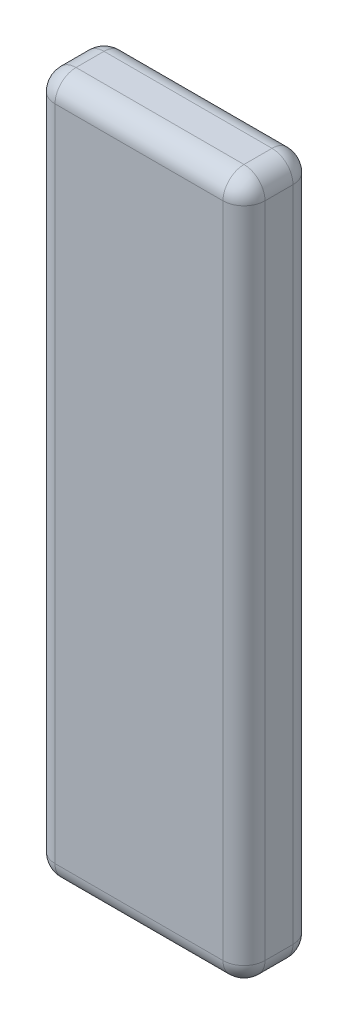
ISO-10303-21;
HEADER;
FILE_DESCRIPTION(('STEP AP214'),'2;1');
FILE_NAME('part.step','',(''),(''),'','','');
FILE_SCHEMA(('AUTOMOTIVE_DESIGN { 1 0 10303 214 1 1 1 1 }'));
ENDSEC;
DATA;
#1=APPLICATION_CONTEXT('core data for automotive mechanical design processes');
#2=APPLICATION_PROTOCOL_DEFINITION('international standard','automotive_design',2000,#1);
#3=PRODUCT_CONTEXT('',#1,'mechanical');
#4=PRODUCT('Part','Part','',(#3));
#5=PRODUCT_RELATED_PRODUCT_CATEGORY('part','',(#4));
#6=PRODUCT_DEFINITION_FORMATION('','',#4);
#7=PRODUCT_DEFINITION_CONTEXT('part definition',#1,'design');
#8=PRODUCT_DEFINITION('design','',#6,#7);
#9=PRODUCT_DEFINITION_SHAPE('','',#8);
#10=(LENGTH_UNIT() NAMED_UNIT(*) SI_UNIT(.MILLI.,.METRE.));
#11=(NAMED_UNIT(*) PLANE_ANGLE_UNIT() SI_UNIT($,.RADIAN.));
#12=(NAMED_UNIT(*) SI_UNIT($,.STERADIAN.) SOLID_ANGLE_UNIT());
#13=UNCERTAINTY_MEASURE_WITH_UNIT(LENGTH_MEASURE(1.E-05),#10,'distance_accuracy_value','');
#14=(GEOMETRIC_REPRESENTATION_CONTEXT(3) GLOBAL_UNCERTAINTY_ASSIGNED_CONTEXT((#13)) GLOBAL_UNIT_ASSIGNED_CONTEXT((#10,
#11,#12)) REPRESENTATION_CONTEXT('',''));
#15=CARTESIAN_POINT('',(0.,0.,0.));
#16=DIRECTION('',(0.,0.,1.));
#17=DIRECTION('',(1.,0.,0.));
#18=AXIS2_PLACEMENT_3D('',#15,#16,#17);
#19=CARTESIAN_POINT('',(0.,0.,2.));
#20=DIRECTION('',(1.,0.,0.));
#21=DIRECTION('',(0.,0.,-1.));
#22=AXIS2_PLACEMENT_3D('',#19,#20,#21);
#23=PLANE('',#22);
#24=DIRECTION('',(0.,-1.,0.));
#25=VECTOR('',#24,1.);
#26=CARTESIAN_POINT('',(0.,0.,1.4));
#27=LINE('',#26,#25);
#28=CARTESIAN_POINT('',(0.,-19.4,1.4));
#29=VERTEX_POINT('',#28);
#30=CARTESIAN_POINT('',(0.,-0.6,1.4));
#31=VERTEX_POINT('',#30);
#32=EDGE_CURVE('E135',#29,#31,#27,.F.);
#33=ORIENTED_EDGE('',*,*,#32,.T.);
#34=DIRECTION('',(0.,0.,-1.));
#35=VECTOR('',#34,1.);
#36=CARTESIAN_POINT('',(0.,-0.6,2.));
#37=LINE('',#36,#35);
#38=CARTESIAN_POINT('',(0.,-0.6,0.6));
#39=VERTEX_POINT('',#38);
#40=EDGE_CURVE('E172',#31,#39,#37,.T.);
#41=ORIENTED_EDGE('',*,*,#40,.T.);
#42=DIRECTION('',(0.,-1.,0.));
#43=VECTOR('',#42,1.);
#44=CARTESIAN_POINT('',(0.,0.,0.6));
#45=LINE('',#44,#43);
#46=CARTESIAN_POINT('',(0.,-19.4,0.6));
#47=VERTEX_POINT('',#46);
#48=EDGE_CURVE('E138',#39,#47,#45,.T.);
#49=ORIENTED_EDGE('',*,*,#48,.T.);
#50=DIRECTION('',(0.,0.,-1.));
#51=VECTOR('',#50,1.);
#52=CARTESIAN_POINT('',(0.,-19.4,2.));
#53=LINE('',#52,#51);
#54=EDGE_CURVE('E131',#47,#29,#53,.F.);
#55=ORIENTED_EDGE('',*,*,#54,.T.);
#56=EDGE_LOOP('',(#33,#41,#49,#55));
#57=FACE_BOUND('',#56,.T.);
#58=ADVANCED_FACE('F43',(#57),#23,.F.);
#59=CARTESIAN_POINT('',(0.,-20.,2.));
#60=DIRECTION('',(0.,1.,0.));
#61=DIRECTION('',(0.,0.,1.));
#62=AXIS2_PLACEMENT_3D('',#59,#60,#61);
#63=PLANE('',#62);
#64=DIRECTION('',(1.,0.,0.));
#65=VECTOR('',#64,1.);
#66=CARTESIAN_POINT('',(0.,-20.,1.4));
#67=LINE('',#66,#65);
#68=CARTESIAN_POINT('',(5.4,-20.,1.4));
#69=VERTEX_POINT('',#68);
#70=CARTESIAN_POINT('',(0.6,-20.,1.4));
#71=VERTEX_POINT('',#70);
#72=EDGE_CURVE('E192',#69,#71,#67,.F.);
#73=ORIENTED_EDGE('',*,*,#72,.T.);
#74=DIRECTION('',(0.,0.,-1.));
#75=VECTOR('',#74,1.);
#76=CARTESIAN_POINT('',(0.6,-20.,2.));
#77=LINE('',#76,#75);
#78=CARTESIAN_POINT('',(0.6,-20.,0.6));
#79=VERTEX_POINT('',#78);
#80=EDGE_CURVE('E149',#71,#79,#77,.T.);
#81=ORIENTED_EDGE('',*,*,#80,.T.);
#82=DIRECTION('',(1.,0.,0.));
#83=VECTOR('',#82,1.);
#84=CARTESIAN_POINT('',(0.,-20.,0.6));
#85=LINE('',#84,#83);
#86=CARTESIAN_POINT('',(5.4,-20.,0.6));
#87=VERTEX_POINT('',#86);
#88=EDGE_CURVE('E196',#79,#87,#85,.T.);
#89=ORIENTED_EDGE('',*,*,#88,.T.);
#90=DIRECTION('',(0.,0.,-1.));
#91=VECTOR('',#90,1.);
#92=CARTESIAN_POINT('',(5.4,-20.,2.));
#93=LINE('',#92,#91);
#94=EDGE_CURVE('E194',#87,#69,#93,.F.);
#95=ORIENTED_EDGE('',*,*,#94,.T.);
#96=EDGE_LOOP('',(#73,#81,#89,#95));
#97=FACE_BOUND('',#96,.T.);
#98=ADVANCED_FACE('F306',(#97),#63,.F.);
#99=CARTESIAN_POINT('',(6.,0.,2.));
#100=DIRECTION('',(-1.,0.,0.));
#101=DIRECTION('',(0.,-1.,0.));
#102=AXIS2_PLACEMENT_3D('',#99,#100,#101);
#103=PLANE('',#102);
#104=DIRECTION('',(0.,0.,-1.));
#105=VECTOR('',#104,1.);
#106=CARTESIAN_POINT('',(6.,-19.4,2.));
#107=LINE('',#106,#105);
#108=CARTESIAN_POINT('',(6.,-19.4,1.4));
#109=VERTEX_POINT('',#108);
#110=CARTESIAN_POINT('',(6.,-19.4,0.6));
#111=VERTEX_POINT('',#110);
#112=EDGE_CURVE('E203',#109,#111,#107,.T.);
#113=ORIENTED_EDGE('',*,*,#112,.T.);
#114=DIRECTION('',(0.,1.,0.));
#115=VECTOR('',#114,1.);
#116=CARTESIAN_POINT('',(6.,0.,0.6));
#117=LINE('',#116,#115);
#118=CARTESIAN_POINT('',(6.,-0.6,0.6));
#119=VERTEX_POINT('',#118);
#120=EDGE_CURVE('E206',#111,#119,#117,.T.);
#121=ORIENTED_EDGE('',*,*,#120,.T.);
#122=DIRECTION('',(0.,0.,-1.));
#123=VECTOR('',#122,1.);
#124=CARTESIAN_POINT('',(6.,-0.6,2.));
#125=LINE('',#124,#123);
#126=CARTESIAN_POINT('',(6.,-0.6,1.4));
#127=VERTEX_POINT('',#126);
#128=EDGE_CURVE('E201',#119,#127,#125,.F.);
#129=ORIENTED_EDGE('',*,*,#128,.T.);
#130=DIRECTION('',(0.,1.,0.));
#131=VECTOR('',#130,1.);
#132=CARTESIAN_POINT('',(6.,-20.,1.4));
#133=LINE('',#132,#131);
#134=EDGE_CURVE('E199',#127,#109,#133,.F.);
#135=ORIENTED_EDGE('',*,*,#134,.T.);
#136=EDGE_LOOP('',(#113,#121,#129,#135));
#137=FACE_BOUND('',#136,.T.);
#138=ADVANCED_FACE('F283',(#137),#103,.F.);
#139=CARTESIAN_POINT('',(0.,0.,2.));
#140=DIRECTION('',(0.,-1.,0.));
#141=DIRECTION('',(0.,0.,-1.));
#142=AXIS2_PLACEMENT_3D('',#139,#140,#141);
#143=PLANE('',#142);
#144=DIRECTION('',(-1.,0.,0.));
#145=VECTOR('',#144,1.);
#146=CARTESIAN_POINT('',(0.,0.,0.6));
#147=LINE('',#146,#145);
#148=CARTESIAN_POINT('',(5.4,0.,0.6));
#149=VERTEX_POINT('',#148);
#150=CARTESIAN_POINT('',(0.6,0.,0.6));
#151=VERTEX_POINT('',#150);
#152=EDGE_CURVE('E178',#149,#151,#147,.T.);
#153=ORIENTED_EDGE('',*,*,#152,.T.);
#154=DIRECTION('',(0.,0.,-1.));
#155=VECTOR('',#154,1.);
#156=CARTESIAN_POINT('',(0.6,0.,2.));
#157=LINE('',#156,#155);
#158=CARTESIAN_POINT('',(0.6,0.,1.4));
#159=VERTEX_POINT('',#158);
#160=EDGE_CURVE('E180',#151,#159,#157,.F.);
#161=ORIENTED_EDGE('',*,*,#160,.T.);
#162=DIRECTION('',(-1.,0.,0.));
#163=VECTOR('',#162,1.);
#164=CARTESIAN_POINT('',(6.,0.,1.4));
#165=LINE('',#164,#163);
#166=CARTESIAN_POINT('',(5.4,0.,1.4));
#167=VERTEX_POINT('',#166);
#168=EDGE_CURVE('E174',#159,#167,#165,.F.);
#169=ORIENTED_EDGE('',*,*,#168,.T.);
#170=DIRECTION('',(0.,0.,-1.));
#171=VECTOR('',#170,1.);
#172=CARTESIAN_POINT('',(5.4,0.,2.));
#173=LINE('',#172,#171);
#174=EDGE_CURVE('E176',#167,#149,#173,.T.);
#175=ORIENTED_EDGE('',*,*,#174,.T.);
#176=EDGE_LOOP('',(#153,#161,#169,#175));
#177=FACE_BOUND('',#176,.T.);
#178=ADVANCED_FACE('F313',(#177),#143,.F.);
#179=CARTESIAN_POINT('',(0.,0.,2.));
#180=DIRECTION('',(0.,0.,1.));
#181=DIRECTION('',(1.,0.,0.));
#182=AXIS2_PLACEMENT_3D('',#179,#180,#181);
#183=PLANE('',#182);
#184=DIRECTION('',(0.,1.,0.));
#185=VECTOR('',#184,1.);
#186=CARTESIAN_POINT('',(5.4,0.,2.));
#187=LINE('',#186,#185);
#188=CARTESIAN_POINT('',(5.4,-19.4,2.));
#189=VERTEX_POINT('',#188);
#190=CARTESIAN_POINT('',(5.4,-0.6,2.));
#191=VERTEX_POINT('',#190);
#192=EDGE_CURVE('E52',#189,#191,#187,.T.);
#193=ORIENTED_EDGE('',*,*,#192,.T.);
#194=DIRECTION('',(-1.,0.,0.));
#195=VECTOR('',#194,1.);
#196=CARTESIAN_POINT('',(0.,-0.6,2.));
#197=LINE('',#196,#195);
#198=CARTESIAN_POINT('',(0.6,-0.6,2.));
#199=VERTEX_POINT('',#198);
#200=EDGE_CURVE('E11',#191,#199,#197,.T.);
#201=ORIENTED_EDGE('',*,*,#200,.T.);
#202=DIRECTION('',(0.,-1.,0.));
#203=VECTOR('',#202,1.);
#204=CARTESIAN_POINT('',(0.6,-20.,2.));
#205=LINE('',#204,#203);
#206=CARTESIAN_POINT('',(0.6,-19.4,2.));
#207=VERTEX_POINT('',#206);
#208=EDGE_CURVE('E208',#199,#207,#205,.T.);
#209=ORIENTED_EDGE('',*,*,#208,.T.);
#210=DIRECTION('',(1.,0.,0.));
#211=VECTOR('',#210,1.);
#212=CARTESIAN_POINT('',(6.,-19.4,2.));
#213=LINE('',#212,#211);
#214=EDGE_CURVE('E63',#207,#189,#213,.T.);
#215=ORIENTED_EDGE('',*,*,#214,.T.);
#216=EDGE_LOOP('',(#193,#201,#209,#215));
#217=FACE_BOUND('',#216,.T.);
#218=ADVANCED_FACE('F376',(#217),#183,.T.);
#219=CARTESIAN_POINT('',(0.,0.,0.));
#220=DIRECTION('',(0.,0.,1.));
#221=DIRECTION('',(1.,0.,0.));
#222=AXIS2_PLACEMENT_3D('',#219,#220,#221);
#223=PLANE('',#222);
#224=DIRECTION('',(0.,-1.,0.));
#225=VECTOR('',#224,1.);
#226=CARTESIAN_POINT('',(0.6,0.,0.));
#227=LINE('',#226,#225);
#228=CARTESIAN_POINT('',(0.6,-19.4,0.));
#229=VERTEX_POINT('',#228);
#230=CARTESIAN_POINT('',(0.6,-0.6,0.));
#231=VERTEX_POINT('',#230);
#232=EDGE_CURVE('E187',#229,#231,#227,.F.);
#233=ORIENTED_EDGE('',*,*,#232,.T.);
#234=DIRECTION('',(-1.,0.,0.));
#235=VECTOR('',#234,1.);
#236=CARTESIAN_POINT('',(0.,-0.6,0.));
#237=LINE('',#236,#235);
#238=CARTESIAN_POINT('',(5.4,-0.6,0.));
#239=VERTEX_POINT('',#238);
#240=EDGE_CURVE('E189',#231,#239,#237,.F.);
#241=ORIENTED_EDGE('',*,*,#240,.T.);
#242=DIRECTION('',(0.,1.,0.));
#243=VECTOR('',#242,1.);
#244=CARTESIAN_POINT('',(5.4,0.,0.));
#245=LINE('',#244,#243);
#246=CARTESIAN_POINT('',(5.4,-19.4,0.));
#247=VERTEX_POINT('',#246);
#248=EDGE_CURVE('E183',#239,#247,#245,.F.);
#249=ORIENTED_EDGE('',*,*,#248,.T.);
#250=DIRECTION('',(1.,0.,0.));
#251=VECTOR('',#250,1.);
#252=CARTESIAN_POINT('',(0.,-19.4,0.));
#253=LINE('',#252,#251);
#254=EDGE_CURVE('E185',#247,#229,#253,.F.);
#255=ORIENTED_EDGE('',*,*,#254,.T.);
#256=EDGE_LOOP('',(#233,#241,#249,#255));
#257=FACE_BOUND('',#256,.T.);
#258=ADVANCED_FACE('F274',(#257),#223,.F.);
#259=CARTESIAN_POINT('',(5.4,-19.4,2.));
#260=DIRECTION('',(0.,0.,-1.));
#261=DIRECTION('',(-1.,0.,0.));
#262=AXIS2_PLACEMENT_3D('',#259,#260,#261);
#263=CYLINDRICAL_SURFACE('',#262,0.6);
#264=CARTESIAN_POINT('',(5.4,-19.4,1.4));
#265=DIRECTION('',(0.,0.,1.));
#266=DIRECTION('',(1.,0.,0.));
#267=AXIS2_PLACEMENT_3D('',#264,#265,#266);
#268=CIRCLE('',#267,0.6);
#269=EDGE_CURVE('E47',#69,#109,#268,.T.);
#270=ORIENTED_EDGE('',*,*,#269,.F.);
#271=ORIENTED_EDGE('',*,*,#94,.F.);
#272=CARTESIAN_POINT('',(5.4,-19.4,0.6));
#273=DIRECTION('',(0.,0.,-1.));
#274=DIRECTION('',(-1.,0.,0.));
#275=AXIS2_PLACEMENT_3D('',#272,#273,#274);
#276=CIRCLE('',#275,0.6);
#277=EDGE_CURVE('E169',#111,#87,#276,.T.);
#278=ORIENTED_EDGE('',*,*,#277,.F.);
#279=ORIENTED_EDGE('',*,*,#112,.F.);
#280=EDGE_LOOP('',(#270,#271,#278,#279));
#281=FACE_BOUND('',#280,.T.);
#282=ADVANCED_FACE('F45',(#281),#263,.T.);
#283=CARTESIAN_POINT('',(5.4,-19.4,1.4));
#284=DIRECTION('',(1.,0.,0.));
#285=DIRECTION('',(0.,0.,-1.));
#286=AXIS2_PLACEMENT_3D('',#283,#284,#285);
#287=SPHERICAL_SURFACE('',#286,0.6);
#288=CARTESIAN_POINT('',(5.4,-19.4,1.4));
#289=DIRECTION('',(1.,0.,0.));
#290=DIRECTION('',(0.,0.,-1.));
#291=AXIS2_PLACEMENT_3D('',#288,#289,#290);
#292=CIRCLE('',#291,0.6);
#293=EDGE_CURVE('E254',#69,#189,#292,.F.);
#294=ORIENTED_EDGE('',*,*,#293,.F.);
#295=ORIENTED_EDGE('',*,*,#269,.T.);
#296=CARTESIAN_POINT('',(5.4,-19.4,1.4));
#297=DIRECTION('',(0.,-1.,0.));
#298=DIRECTION('',(0.,0.,-1.));
#299=AXIS2_PLACEMENT_3D('',#296,#297,#298);
#300=CIRCLE('',#299,0.6);
#301=EDGE_CURVE('E256',#189,#109,#300,.F.);
#302=ORIENTED_EDGE('',*,*,#301,.F.);
#303=EDGE_LOOP('',(#294,#295,#302));
#304=FACE_BOUND('',#303,.T.);
#305=ADVANCED_FACE('F301',(#304),#287,.T.);
#306=CARTESIAN_POINT('',(5.4,-19.4,0.6));
#307=DIRECTION('',(0.,-1.,0.));
#308=DIRECTION('',(0.,0.,-1.));
#309=AXIS2_PLACEMENT_3D('',#306,#307,#308);
#310=SPHERICAL_SURFACE('',#309,0.6);
#311=CARTESIAN_POINT('',(5.4,-19.4,0.6));
#312=DIRECTION('',(0.,-1.,0.));
#313=DIRECTION('',(0.,0.,-1.));
#314=AXIS2_PLACEMENT_3D('',#311,#312,#313);
#315=CIRCLE('',#314,0.6);
#316=EDGE_CURVE('E248',#111,#247,#315,.F.);
#317=ORIENTED_EDGE('',*,*,#316,.F.);
#318=ORIENTED_EDGE('',*,*,#277,.T.);
#319=CARTESIAN_POINT('',(5.4,-19.4,0.6));
#320=DIRECTION('',(1.,0.,0.));
#321=DIRECTION('',(0.,0.,-1.));
#322=AXIS2_PLACEMENT_3D('',#319,#320,#321);
#323=CIRCLE('',#322,0.6);
#324=EDGE_CURVE('E251',#247,#87,#323,.F.);
#325=ORIENTED_EDGE('',*,*,#324,.F.);
#326=EDGE_LOOP('',(#317,#318,#325));
#327=FACE_BOUND('',#326,.T.);
#328=ADVANCED_FACE('F263',(#327),#310,.T.);
#329=CARTESIAN_POINT('',(5.4,0.,1.4));
#330=DIRECTION('',(0.,-1.,0.));
#331=DIRECTION('',(1.,0.,0.));
#332=AXIS2_PLACEMENT_3D('',#329,#330,#331);
#333=CYLINDRICAL_SURFACE('',#332,0.6);
#334=ORIENTED_EDGE('',*,*,#301,.T.);
#335=ORIENTED_EDGE('',*,*,#134,.F.);
#336=CARTESIAN_POINT('',(5.4,-0.6,1.4));
#337=DIRECTION('',(0.,1.,0.));
#338=DIRECTION('',(-1.,0.,0.));
#339=AXIS2_PLACEMENT_3D('',#336,#337,#338);
#340=CIRCLE('',#339,0.6);
#341=EDGE_CURVE('E242',#191,#127,#340,.T.);
#342=ORIENTED_EDGE('',*,*,#341,.F.);
#343=ORIENTED_EDGE('',*,*,#192,.F.);
#344=EDGE_LOOP('',(#334,#335,#342,#343));
#345=FACE_BOUND('',#344,.T.);
#346=ADVANCED_FACE('F296',(#345),#333,.T.);
#347=CARTESIAN_POINT('',(0.,-19.4,1.4));
#348=DIRECTION('',(-1.,0.,0.));
#349=DIRECTION('',(0.,0.,1.));
#350=AXIS2_PLACEMENT_3D('',#347,#348,#349);
#351=CYLINDRICAL_SURFACE('',#350,0.6);
#352=ORIENTED_EDGE('',*,*,#293,.T.);
#353=ORIENTED_EDGE('',*,*,#214,.F.);
#354=CARTESIAN_POINT('',(0.6,-19.4,1.4));
#355=DIRECTION('',(-1.,0.,0.));
#356=DIRECTION('',(0.,0.,1.));
#357=AXIS2_PLACEMENT_3D('',#354,#355,#356);
#358=CIRCLE('',#357,0.6);
#359=EDGE_CURVE('E153',#71,#207,#358,.T.);
#360=ORIENTED_EDGE('',*,*,#359,.F.);
#361=ORIENTED_EDGE('',*,*,#72,.F.);
#362=EDGE_LOOP('',(#352,#353,#360,#361));
#363=FACE_BOUND('',#362,.T.);
#364=ADVANCED_FACE('F304',(#363),#351,.T.);
#365=CARTESIAN_POINT('',(0.6,-19.4,2.));
#366=DIRECTION('',(0.,0.,-1.));
#367=DIRECTION('',(-1.,0.,0.));
#368=AXIS2_PLACEMENT_3D('',#365,#366,#367);
#369=CYLINDRICAL_SURFACE('',#368,0.6);
#370=CARTESIAN_POINT('',(0.6,-19.4,0.6));
#371=DIRECTION('',(0.,0.,-1.));
#372=DIRECTION('',(-1.,0.,0.));
#373=AXIS2_PLACEMENT_3D('',#370,#371,#372);
#374=CIRCLE('',#373,0.6);
#375=EDGE_CURVE('E154',#79,#47,#374,.T.);
#376=ORIENTED_EDGE('',*,*,#375,.F.);
#377=ORIENTED_EDGE('',*,*,#80,.F.);
#378=CARTESIAN_POINT('',(0.6,-19.4,1.4));
#379=DIRECTION('',(0.,0.,1.));
#380=DIRECTION('',(1.,0.,0.));
#381=AXIS2_PLACEMENT_3D('',#378,#379,#380);
#382=CIRCLE('',#381,0.6);
#383=EDGE_CURVE('E145',#29,#71,#382,.T.);
#384=ORIENTED_EDGE('',*,*,#383,.F.);
#385=ORIENTED_EDGE('',*,*,#54,.F.);
#386=EDGE_LOOP('',(#376,#377,#384,#385));
#387=FACE_BOUND('',#386,.T.);
#388=ADVANCED_FACE('F147',(#387),#369,.T.);
#389=CARTESIAN_POINT('',(0.,-19.4,0.6));
#390=DIRECTION('',(1.,0.,0.));
#391=DIRECTION('',(0.,0.,-1.));
#392=AXIS2_PLACEMENT_3D('',#389,#390,#391);
#393=CYLINDRICAL_SURFACE('',#392,0.6);
#394=ORIENTED_EDGE('',*,*,#324,.T.);
#395=ORIENTED_EDGE('',*,*,#88,.F.);
#396=CARTESIAN_POINT('',(0.6,-19.4,0.6));
#397=DIRECTION('',(-1.,0.,0.));
#398=DIRECTION('',(0.,0.,1.));
#399=AXIS2_PLACEMENT_3D('',#396,#397,#398);
#400=CIRCLE('',#399,0.6);
#401=EDGE_CURVE('E238',#229,#79,#400,.T.);
#402=ORIENTED_EDGE('',*,*,#401,.F.);
#403=ORIENTED_EDGE('',*,*,#254,.F.);
#404=EDGE_LOOP('',(#394,#395,#402,#403));
#405=FACE_BOUND('',#404,.T.);
#406=ADVANCED_FACE('F270',(#405),#393,.T.);
#407=CARTESIAN_POINT('',(5.4,0.,0.6));
#408=DIRECTION('',(0.,1.,0.));
#409=DIRECTION('',(-1.,0.,0.));
#410=AXIS2_PLACEMENT_3D('',#407,#408,#409);
#411=CYLINDRICAL_SURFACE('',#410,0.6);
#412=ORIENTED_EDGE('',*,*,#316,.T.);
#413=ORIENTED_EDGE('',*,*,#248,.F.);
#414=CARTESIAN_POINT('',(5.4,-0.6,0.6));
#415=DIRECTION('',(0.,1.,0.));
#416=DIRECTION('',(-1.,0.,0.));
#417=AXIS2_PLACEMENT_3D('',#414,#415,#416);
#418=CIRCLE('',#417,0.6);
#419=EDGE_CURVE('E235',#119,#239,#418,.T.);
#420=ORIENTED_EDGE('',*,*,#419,.F.);
#421=ORIENTED_EDGE('',*,*,#120,.F.);
#422=EDGE_LOOP('',(#412,#413,#420,#421));
#423=FACE_BOUND('',#422,.T.);
#424=ADVANCED_FACE('F280',(#423),#411,.T.);
#425=CARTESIAN_POINT('',(5.4,-0.6,2.));
#426=DIRECTION('',(0.,0.,-1.));
#427=DIRECTION('',(-1.,0.,0.));
#428=AXIS2_PLACEMENT_3D('',#425,#426,#427);
#429=CYLINDRICAL_SURFACE('',#428,0.6);
#430=CARTESIAN_POINT('',(5.4,-0.6,1.4));
#431=DIRECTION('',(0.,0.,1.));
#432=DIRECTION('',(1.,0.,0.));
#433=AXIS2_PLACEMENT_3D('',#430,#431,#432);
#434=CIRCLE('',#433,0.6);
#435=EDGE_CURVE('E245',#127,#167,#434,.T.);
#436=ORIENTED_EDGE('',*,*,#435,.F.);
#437=ORIENTED_EDGE('',*,*,#128,.F.);
#438=CARTESIAN_POINT('',(5.4,-0.6,0.6));
#439=DIRECTION('',(0.,0.,-1.));
#440=DIRECTION('',(-1.,0.,0.));
#441=AXIS2_PLACEMENT_3D('',#438,#439,#440);
#442=CIRCLE('',#441,0.6);
#443=EDGE_CURVE('E232',#149,#119,#442,.T.);
#444=ORIENTED_EDGE('',*,*,#443,.F.);
#445=ORIENTED_EDGE('',*,*,#174,.F.);
#446=EDGE_LOOP('',(#436,#437,#444,#445));
#447=FACE_BOUND('',#446,.T.);
#448=ADVANCED_FACE('F288',(#447),#429,.T.);
#449=CARTESIAN_POINT('',(5.4,-0.6,1.4));
#450=DIRECTION('',(1.,0.,0.));
#451=DIRECTION('',(0.,1.,0.));
#452=AXIS2_PLACEMENT_3D('',#449,#450,#451);
#453=SPHERICAL_SURFACE('',#452,0.6);
#454=ORIENTED_EDGE('',*,*,#341,.T.);
#455=ORIENTED_EDGE('',*,*,#435,.T.);
#456=CARTESIAN_POINT('',(5.4,-0.6,1.4));
#457=DIRECTION('',(1.,0.,0.));
#458=DIRECTION('',(0.,0.,-1.));
#459=AXIS2_PLACEMENT_3D('',#456,#457,#458);
#460=CIRCLE('',#459,0.6);
#461=EDGE_CURVE('E161',#191,#167,#460,.F.);
#462=ORIENTED_EDGE('',*,*,#461,.F.);
#463=EDGE_LOOP('',(#454,#455,#462));
#464=FACE_BOUND('',#463,.T.);
#465=ADVANCED_FACE('F293',(#464),#453,.T.);
#466=CARTESIAN_POINT('',(0.6,-19.4,1.4));
#467=DIRECTION('',(0.,-1.,0.));
#468=DIRECTION('',(0.,0.,-1.));
#469=AXIS2_PLACEMENT_3D('',#466,#467,#468);
#470=SPHERICAL_SURFACE('',#469,0.6);
#471=ORIENTED_EDGE('',*,*,#383,.T.);
#472=ORIENTED_EDGE('',*,*,#359,.T.);
#473=CARTESIAN_POINT('',(0.6,-19.4,1.4));
#474=DIRECTION('',(0.,-1.,0.));
#475=DIRECTION('',(0.,0.,-1.));
#476=AXIS2_PLACEMENT_3D('',#473,#474,#475);
#477=CIRCLE('',#476,0.6);
#478=EDGE_CURVE('E157',#29,#207,#477,.F.);
#479=ORIENTED_EDGE('',*,*,#478,.F.);
#480=EDGE_LOOP('',(#471,#472,#479));
#481=FACE_BOUND('',#480,.T.);
#482=ADVANCED_FACE('F158',(#481),#470,.T.);
#483=CARTESIAN_POINT('',(0.6,-19.4,0.6));
#484=DIRECTION('',(0.,-1.,0.));
#485=DIRECTION('',(0.,0.,-1.));
#486=AXIS2_PLACEMENT_3D('',#483,#484,#485);
#487=SPHERICAL_SURFACE('',#486,0.6);
#488=ORIENTED_EDGE('',*,*,#401,.T.);
#489=ORIENTED_EDGE('',*,*,#375,.T.);
#490=CARTESIAN_POINT('',(0.6,-19.4,0.6));
#491=DIRECTION('',(0.,-1.,0.));
#492=DIRECTION('',(0.,0.,-1.));
#493=AXIS2_PLACEMENT_3D('',#490,#491,#492);
#494=CIRCLE('',#493,0.6);
#495=EDGE_CURVE('E162',#229,#47,#494,.F.);
#496=ORIENTED_EDGE('',*,*,#495,.F.);
#497=EDGE_LOOP('',(#488,#489,#496));
#498=FACE_BOUND('',#497,.T.);
#499=ADVANCED_FACE('F347',(#498),#487,.T.);
#500=CARTESIAN_POINT('',(5.4,-0.6,0.6));
#501=DIRECTION('',(1.,0.,0.));
#502=DIRECTION('',(0.,0.,-1.));
#503=AXIS2_PLACEMENT_3D('',#500,#501,#502);
#504=SPHERICAL_SURFACE('',#503,0.6);
#505=ORIENTED_EDGE('',*,*,#443,.T.);
#506=ORIENTED_EDGE('',*,*,#419,.T.);
#507=CARTESIAN_POINT('',(5.4,-0.6,0.6));
#508=DIRECTION('',(1.,0.,0.));
#509=DIRECTION('',(0.,0.,-1.));
#510=AXIS2_PLACEMENT_3D('',#507,#508,#509);
#511=CIRCLE('',#510,0.6);
#512=EDGE_CURVE('E226',#149,#239,#511,.F.);
#513=ORIENTED_EDGE('',*,*,#512,.F.);
#514=EDGE_LOOP('',(#505,#506,#513));
#515=FACE_BOUND('',#514,.T.);
#516=ADVANCED_FACE('F343',(#515),#504,.T.);
#517=CARTESIAN_POINT('',(0.,-0.6,1.4));
#518=DIRECTION('',(1.,0.,0.));
#519=DIRECTION('',(0.,0.,-1.));
#520=AXIS2_PLACEMENT_3D('',#517,#518,#519);
#521=CYLINDRICAL_SURFACE('',#520,0.6);
#522=ORIENTED_EDGE('',*,*,#461,.T.);
#523=ORIENTED_EDGE('',*,*,#168,.F.);
#524=CARTESIAN_POINT('',(0.6,-0.6,1.4));
#525=DIRECTION('',(-1.,0.,0.));
#526=DIRECTION('',(0.,0.,1.));
#527=AXIS2_PLACEMENT_3D('',#524,#525,#526);
#528=CIRCLE('',#527,0.6);
#529=EDGE_CURVE('E223',#199,#159,#528,.T.);
#530=ORIENTED_EDGE('',*,*,#529,.F.);
#531=ORIENTED_EDGE('',*,*,#200,.F.);
#532=EDGE_LOOP('',(#522,#523,#530,#531));
#533=FACE_BOUND('',#532,.T.);
#534=ADVANCED_FACE('F340',(#533),#521,.T.);
#535=CARTESIAN_POINT('',(0.6,0.,1.4));
#536=DIRECTION('',(0.,1.,0.));
#537=DIRECTION('',(0.,0.,1.));
#538=AXIS2_PLACEMENT_3D('',#535,#536,#537);
#539=CYLINDRICAL_SURFACE('',#538,0.6);
#540=ORIENTED_EDGE('',*,*,#478,.T.);
#541=ORIENTED_EDGE('',*,*,#208,.F.);
#542=CARTESIAN_POINT('',(0.6,-0.6,1.4));
#543=DIRECTION('',(0.,1.,0.));
#544=DIRECTION('',(0.,0.,1.));
#545=AXIS2_PLACEMENT_3D('',#542,#543,#544);
#546=CIRCLE('',#545,0.6);
#547=EDGE_CURVE('E165',#31,#199,#546,.T.);
#548=ORIENTED_EDGE('',*,*,#547,.F.);
#549=ORIENTED_EDGE('',*,*,#32,.F.);
#550=EDGE_LOOP('',(#540,#541,#548,#549));
#551=FACE_BOUND('',#550,.T.);
#552=ADVANCED_FACE('F164',(#551),#539,.T.);
#553=CARTESIAN_POINT('',(0.6,0.,0.6));
#554=DIRECTION('',(0.,-1.,0.));
#555=DIRECTION('',(0.,0.,-1.));
#556=AXIS2_PLACEMENT_3D('',#553,#554,#555);
#557=CYLINDRICAL_SURFACE('',#556,0.6);
#558=ORIENTED_EDGE('',*,*,#495,.T.);
#559=ORIENTED_EDGE('',*,*,#48,.F.);
#560=CARTESIAN_POINT('',(0.6,-0.6,0.6));
#561=DIRECTION('',(0.,1.,0.));
#562=DIRECTION('',(0.,0.,1.));
#563=AXIS2_PLACEMENT_3D('',#560,#561,#562);
#564=CIRCLE('',#563,0.6);
#565=EDGE_CURVE('E219',#231,#39,#564,.T.);
#566=ORIENTED_EDGE('',*,*,#565,.F.);
#567=ORIENTED_EDGE('',*,*,#232,.F.);
#568=EDGE_LOOP('',(#558,#559,#566,#567));
#569=FACE_BOUND('',#568,.T.);
#570=ADVANCED_FACE('F333',(#569),#557,.T.);
#571=CARTESIAN_POINT('',(0.,-0.6,0.6));
#572=DIRECTION('',(-1.,0.,0.));
#573=DIRECTION('',(0.,0.,1.));
#574=AXIS2_PLACEMENT_3D('',#571,#572,#573);
#575=CYLINDRICAL_SURFACE('',#574,0.6);
#576=ORIENTED_EDGE('',*,*,#512,.T.);
#577=ORIENTED_EDGE('',*,*,#240,.F.);
#578=CARTESIAN_POINT('',(0.6,-0.6,0.6));
#579=DIRECTION('',(-1.,0.,0.));
#580=DIRECTION('',(0.,0.,1.));
#581=AXIS2_PLACEMENT_3D('',#578,#579,#580);
#582=CIRCLE('',#581,0.6);
#583=EDGE_CURVE('E216',#151,#231,#582,.T.);
#584=ORIENTED_EDGE('',*,*,#583,.F.);
#585=ORIENTED_EDGE('',*,*,#152,.F.);
#586=EDGE_LOOP('',(#576,#577,#584,#585));
#587=FACE_BOUND('',#586,.T.);
#588=ADVANCED_FACE('F329',(#587),#575,.T.);
#589=CARTESIAN_POINT('',(0.6,-0.6,1.4));
#590=DIRECTION('',(0.,0.,1.));
#591=DIRECTION('',(1.,0.,0.));
#592=AXIS2_PLACEMENT_3D('',#589,#590,#591);
#593=SPHERICAL_SURFACE('',#592,0.6);
#594=ORIENTED_EDGE('',*,*,#547,.T.);
#595=ORIENTED_EDGE('',*,*,#529,.T.);
#596=CARTESIAN_POINT('',(0.6,-0.6,1.4));
#597=DIRECTION('',(0.,0.,1.));
#598=DIRECTION('',(1.,0.,0.));
#599=AXIS2_PLACEMENT_3D('',#596,#597,#598);
#600=CIRCLE('',#599,0.6);
#601=EDGE_CURVE('E214',#31,#159,#600,.F.);
#602=ORIENTED_EDGE('',*,*,#601,.F.);
#603=EDGE_LOOP('',(#594,#595,#602));
#604=FACE_BOUND('',#603,.T.);
#605=ADVANCED_FACE('F325',(#604),#593,.T.);
#606=CARTESIAN_POINT('',(0.6,-0.6,0.6));
#607=DIRECTION('',(0.,0.,-1.));
#608=DIRECTION('',(-1.,0.,0.));
#609=AXIS2_PLACEMENT_3D('',#606,#607,#608);
#610=SPHERICAL_SURFACE('',#609,0.6);
#611=ORIENTED_EDGE('',*,*,#583,.T.);
#612=ORIENTED_EDGE('',*,*,#565,.T.);
#613=CARTESIAN_POINT('',(0.6,-0.6,0.6));
#614=DIRECTION('',(0.,0.,-1.));
#615=DIRECTION('',(-1.,0.,0.));
#616=AXIS2_PLACEMENT_3D('',#613,#614,#615);
#617=CIRCLE('',#616,0.6);
#618=EDGE_CURVE('E212',#151,#39,#617,.F.);
#619=ORIENTED_EDGE('',*,*,#618,.F.);
#620=EDGE_LOOP('',(#611,#612,#619));
#621=FACE_BOUND('',#620,.T.);
#622=ADVANCED_FACE('F321',(#621),#610,.T.);
#623=CARTESIAN_POINT('',(0.6,-0.6,2.));
#624=DIRECTION('',(0.,0.,-1.));
#625=DIRECTION('',(-1.,0.,0.));
#626=AXIS2_PLACEMENT_3D('',#623,#624,#625);
#627=CYLINDRICAL_SURFACE('',#626,0.6);
#628=ORIENTED_EDGE('',*,*,#601,.T.);
#629=ORIENTED_EDGE('',*,*,#160,.F.);
#630=ORIENTED_EDGE('',*,*,#618,.T.);
#631=ORIENTED_EDGE('',*,*,#40,.F.);
#632=EDGE_LOOP('',(#628,#629,#630,#631));
#633=FACE_BOUND('',#632,.T.);
#634=ADVANCED_FACE('F318',(#633),#627,.T.);
#635=CLOSED_SHELL('',(#58,#98,#138,#178,#218,#258,#282,#305,#328,#346,#364,#388,#406,#424,#448,
#465,#482,#499,#516,#534,#552,#570,#588,#605,#622,#634));
#636=MANIFOLD_SOLID_BREP('B2',#635);
#637=ADVANCED_BREP_SHAPE_REPRESENTATION('',(#18,#636),#14);
#638=SHAPE_DEFINITION_REPRESENTATION(#9,#637);
ENDSEC;
END-ISO-10303-21;
